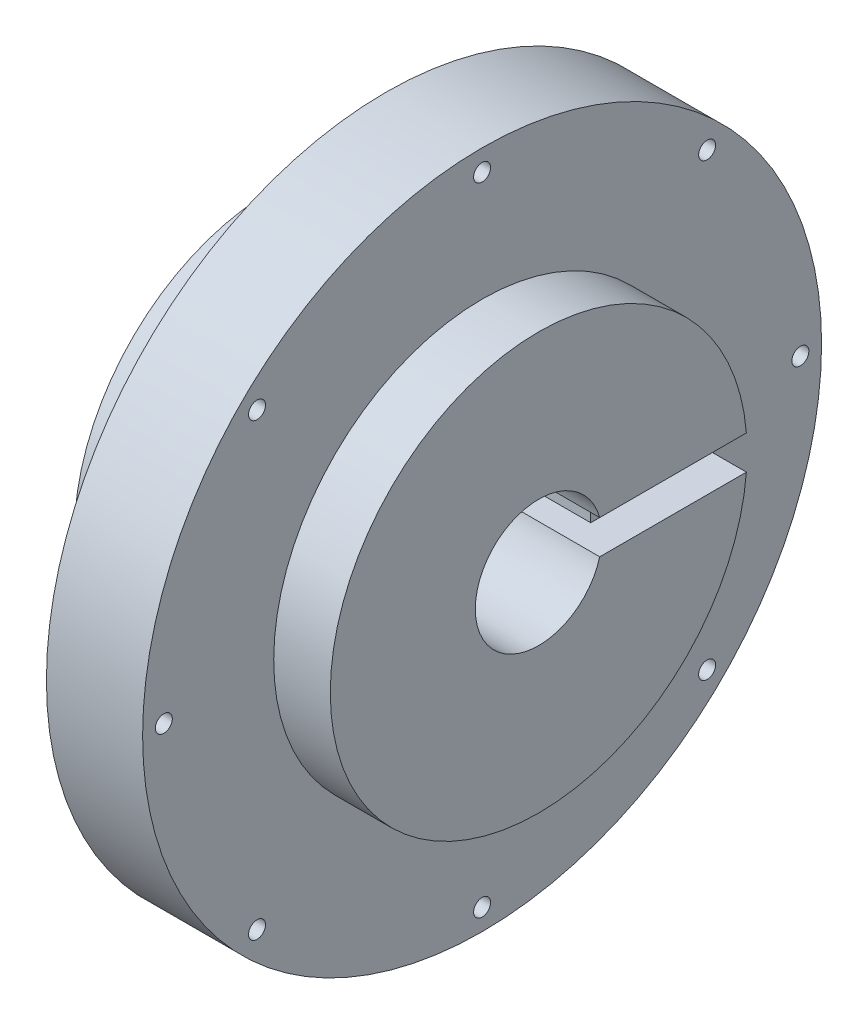
ISO-10303-21;
HEADER;
FILE_DESCRIPTION(('STEP AP214'),'2;1');
FILE_NAME('part.step','',(''),(''),'','','');
FILE_SCHEMA(('AUTOMOTIVE_DESIGN { 1 0 10303 214 1 1 1 1 }'));
ENDSEC;
DATA;
#1=APPLICATION_CONTEXT('core data for automotive mechanical design processes');
#2=APPLICATION_PROTOCOL_DEFINITION('international standard','automotive_design',2000,#1);
#3=PRODUCT_CONTEXT('',#1,'mechanical');
#4=PRODUCT('Part','Part','',(#3));
#5=PRODUCT_RELATED_PRODUCT_CATEGORY('part','',(#4));
#6=PRODUCT_DEFINITION_FORMATION('','',#4);
#7=PRODUCT_DEFINITION_CONTEXT('part definition',#1,'design');
#8=PRODUCT_DEFINITION('design','',#6,#7);
#9=PRODUCT_DEFINITION_SHAPE('','',#8);
#10=(LENGTH_UNIT() NAMED_UNIT(*) SI_UNIT(.MILLI.,.METRE.));
#11=(NAMED_UNIT(*) PLANE_ANGLE_UNIT() SI_UNIT($,.RADIAN.));
#12=(NAMED_UNIT(*) SI_UNIT($,.STERADIAN.) SOLID_ANGLE_UNIT());
#13=UNCERTAINTY_MEASURE_WITH_UNIT(LENGTH_MEASURE(1.E-05),#10,'distance_accuracy_value','');
#14=(GEOMETRIC_REPRESENTATION_CONTEXT(3) GLOBAL_UNCERTAINTY_ASSIGNED_CONTEXT((#13)) GLOBAL_UNIT_ASSIGNED_CONTEXT((#10,
#11,#12)) REPRESENTATION_CONTEXT('',''));
#15=CARTESIAN_POINT('',(0.,0.,0.));
#16=DIRECTION('',(0.,0.,1.));
#17=DIRECTION('',(1.,0.,0.));
#18=AXIS2_PLACEMENT_3D('',#15,#16,#17);
#19=CARTESIAN_POINT('',(51.,63.,-15.2));
#20=DIRECTION('',(0.,0.,1.));
#21=DIRECTION('',(1.,0.,0.));
#22=AXIS2_PLACEMENT_3D('',#19,#20,#21);
#23=PLANE('',#22);
#24=DIRECTION('',(-1.,0.,0.));
#25=VECTOR('',#24,1.);
#26=CARTESIAN_POINT('',(51.,57.,-15.2));
#27=LINE('',#26,#25);
#28=CARTESIAN_POINT('',(4.00000000000002,57.,-15.2));
#29=VERTEX_POINT('',#28);
#30=CARTESIAN_POINT('',(-23.,57.,-15.2));
#31=VERTEX_POINT('',#30);
#32=EDGE_CURVE('E114',#29,#31,#27,.T.);
#33=ORIENTED_EDGE('',*,*,#32,.F.);
#34=DIRECTION('',(0.,-1.,0.));
#35=VECTOR('',#34,1.);
#36=CARTESIAN_POINT('',(4.00000000000001,63.,-15.2));
#37=LINE('',#36,#35);
#38=CARTESIAN_POINT('',(4.00000000000001,63.,-15.2));
#39=VERTEX_POINT('',#38);
#40=EDGE_CURVE('E55',#39,#29,#37,.T.);
#41=ORIENTED_EDGE('',*,*,#40,.F.);
#42=DIRECTION('',(-1.,0.,0.));
#43=VECTOR('',#42,1.);
#44=CARTESIAN_POINT('',(51.,63.,-15.2));
#45=LINE('',#44,#43);
#46=CARTESIAN_POINT('',(-23.,63.,-15.2));
#47=VERTEX_POINT('',#46);
#48=EDGE_CURVE('E106',#39,#47,#45,.T.);
#49=ORIENTED_EDGE('',*,*,#48,.T.);
#50=DIRECTION('',(0.,1.,0.));
#51=VECTOR('',#50,1.);
#52=CARTESIAN_POINT('',(-23.,63.,-15.2));
#53=LINE('',#52,#51);
#54=EDGE_CURVE('E110',#31,#47,#53,.T.);
#55=ORIENTED_EDGE('',*,*,#54,.F.);
#56=EDGE_LOOP('',(#33,#41,#49,#55));
#57=FACE_BOUND('',#56,.T.);
#58=ADVANCED_FACE('F38',(#57),#23,.T.);
#59=CARTESIAN_POINT('',(10.,60.,0.));
#60=DIRECTION('',(1.,0.,0.));
#61=DIRECTION('',(0.,0.,-1.));
#62=AXIS2_PLACEMENT_3D('',#59,#60,#61);
#63=PLANE('',#62);
#64=DIRECTION('',(0.,0.,-1.));
#65=VECTOR('',#64,1.);
#66=CARTESIAN_POINT('',(10.,63.,0.));
#67=LINE('',#66,#65);
#68=CARTESIAN_POINT('',(10.,63.,-10.790736768173));
#69=VERTEX_POINT('',#68);
#70=CARTESIAN_POINT('',(10.,63.,-36.7076136516663));
#71=VERTEX_POINT('',#70);
#72=EDGE_CURVE('E63',#69,#71,#67,.T.);
#73=ORIENTED_EDGE('',*,*,#72,.T.);
#74=CARTESIAN_POINT('',(10.,60.,0.));
#75=DIRECTION('',(1.,0.,0.));
#76=DIRECTION('',(0.,0.,-1.));
#77=AXIS2_PLACEMENT_3D('',#74,#75,#76);
#78=CIRCLE('',#77,36.83);
#79=CARTESIAN_POINT('',(10.,57.,-36.7076136516663));
#80=VERTEX_POINT('',#79);
#81=EDGE_CURVE('E223',#71,#80,#78,.T.);
#82=ORIENTED_EDGE('',*,*,#81,.T.);
#83=DIRECTION('',(0.,0.,1.));
#84=VECTOR('',#83,1.);
#85=CARTESIAN_POINT('',(10.,57.,0.));
#86=LINE('',#85,#84);
#87=CARTESIAN_POINT('',(10.,57.,-10.790736768173));
#88=VERTEX_POINT('',#87);
#89=EDGE_CURVE('E156',#80,#88,#86,.T.);
#90=ORIENTED_EDGE('',*,*,#89,.T.);
#91=CARTESIAN_POINT('',(10.,60.,0.));
#92=DIRECTION('',(1.,0.,0.));
#93=DIRECTION('',(0.,0.,-1.));
#94=AXIS2_PLACEMENT_3D('',#91,#92,#93);
#95=CIRCLE('',#94,11.2);
#96=EDGE_CURVE('E162',#69,#88,#95,.T.);
#97=ORIENTED_EDGE('',*,*,#96,.F.);
#98=EDGE_LOOP('',(#73,#82,#90,#97));
#99=FACE_BOUND('',#98,.T.);
#100=ADVANCED_FACE('F300',(#99),#63,.T.);
#101=CARTESIAN_POINT('',(-19.,60.,0.));
#102=DIRECTION('',(1.,0.,0.));
#103=DIRECTION('',(0.,0.,-1.));
#104=AXIS2_PLACEMENT_3D('',#101,#102,#103);
#105=CYLINDRICAL_SURFACE('',#104,11.2);
#106=DIRECTION('',(1.,0.,0.));
#107=VECTOR('',#106,1.);
#108=CARTESIAN_POINT('',(-19.,63.,-10.790736768173));
#109=LINE('',#108,#107);
#110=CARTESIAN_POINT('',(-19.,63.,-10.790736768173));
#111=VERTEX_POINT('',#110);
#112=EDGE_CURVE('E159',#69,#111,#109,.F.);
#113=ORIENTED_EDGE('',*,*,#112,.F.);
#114=ORIENTED_EDGE('',*,*,#96,.T.);
#115=DIRECTION('',(1.,0.,0.));
#116=VECTOR('',#115,1.);
#117=CARTESIAN_POINT('',(-19.,57.,-10.790736768173));
#118=LINE('',#117,#116);
#119=CARTESIAN_POINT('',(-19.,57.,-10.790736768173));
#120=VERTEX_POINT('',#119);
#121=EDGE_CURVE('E113',#120,#88,#118,.T.);
#122=ORIENTED_EDGE('',*,*,#121,.F.);
#123=CARTESIAN_POINT('',(-19.,60.,0.));
#124=DIRECTION('',(1.,0.,0.));
#125=DIRECTION('',(0.,0.,-1.));
#126=AXIS2_PLACEMENT_3D('',#123,#124,#125);
#127=CIRCLE('',#126,11.2);
#128=EDGE_CURVE('E163',#111,#120,#127,.T.);
#129=ORIENTED_EDGE('',*,*,#128,.F.);
#130=EDGE_LOOP('',(#113,#114,#122,#129));
#131=FACE_BOUND('',#130,.T.);
#132=ADVANCED_FACE('F307',(#131),#105,.F.);
#133=CARTESIAN_POINT('',(0.,60.,0.));
#134=DIRECTION('',(1.,0.,0.));
#135=DIRECTION('',(0.,0.,-1.));
#136=AXIS2_PLACEMENT_3D('',#133,#134,#135);
#137=PLANE('',#136);
#138=CARTESIAN_POINT('',(0.,59.9999999999998,56.25));
#139=DIRECTION('',(1.,0.,0.));
#140=DIRECTION('',(0.,0.,-1.));
#141=AXIS2_PLACEMENT_3D('',#138,#139,#140);
#142=CIRCLE('',#141,1.5);
#143=CARTESIAN_POINT('',(0.,59.9999999999998,54.75));
#144=VERTEX_POINT('',#143);
#145=EDGE_CURVE('E216',#144,#144,#142,.T.);
#146=ORIENTED_EDGE('',*,*,#145,.F.);
#147=EDGE_LOOP('',(#146));
#148=FACE_BOUND('',#147,.T.);
#149=CARTESIAN_POINT('',(0.,20.2252435582565,39.7747564417431));
#150=DIRECTION('',(1.,0.,0.));
#151=DIRECTION('',(0.,0.,-1.));
#152=AXIS2_PLACEMENT_3D('',#149,#150,#151);
#153=CIRCLE('',#152,1.5);
#154=CARTESIAN_POINT('',(0.,20.2252435582565,38.2747564417431));
#155=VERTEX_POINT('',#154);
#156=EDGE_CURVE('E213',#155,#155,#153,.T.);
#157=ORIENTED_EDGE('',*,*,#156,.F.);
#158=EDGE_LOOP('',(#157));
#159=FACE_BOUND('',#158,.T.);
#160=CARTESIAN_POINT('',(0.,3.75,0.));
#161=DIRECTION('',(1.,0.,0.));
#162=DIRECTION('',(0.,0.,-1.));
#163=AXIS2_PLACEMENT_3D('',#160,#161,#162);
#164=CIRCLE('',#163,1.5);
#165=CARTESIAN_POINT('',(0.,3.75,-1.5));
#166=VERTEX_POINT('',#165);
#167=EDGE_CURVE('E209',#166,#166,#164,.T.);
#168=ORIENTED_EDGE('',*,*,#167,.F.);
#169=EDGE_LOOP('',(#168));
#170=FACE_BOUND('',#169,.T.);
#171=CARTESIAN_POINT('',(0.,20.2252435582571,-39.7747564417436));
#172=DIRECTION('',(1.,0.,0.));
#173=DIRECTION('',(0.,0.,-1.));
#174=AXIS2_PLACEMENT_3D('',#171,#172,#173);
#175=CIRCLE('',#174,1.5);
#176=CARTESIAN_POINT('',(0.,20.2252435582571,-41.2747564417436));
#177=VERTEX_POINT('',#176);
#178=EDGE_CURVE('E205',#177,#177,#175,.T.);
#179=ORIENTED_EDGE('',*,*,#178,.F.);
#180=EDGE_LOOP('',(#179));
#181=FACE_BOUND('',#180,.T.);
#182=CARTESIAN_POINT('',(0.,60.0000000000006,-56.25));
#183=DIRECTION('',(1.,0.,0.));
#184=DIRECTION('',(0.,0.,-1.));
#185=AXIS2_PLACEMENT_3D('',#182,#183,#184);
#186=CIRCLE('',#185,1.5);
#187=CARTESIAN_POINT('',(0.,60.0000000000006,-57.75));
#188=VERTEX_POINT('',#187);
#189=EDGE_CURVE('E201',#188,#188,#186,.T.);
#190=ORIENTED_EDGE('',*,*,#189,.F.);
#191=EDGE_LOOP('',(#190));
#192=FACE_BOUND('',#191,.T.);
#193=CARTESIAN_POINT('',(0.,99.7747564417438,-39.7747564417428));
#194=DIRECTION('',(1.,0.,0.));
#195=DIRECTION('',(0.,0.,-1.));
#196=AXIS2_PLACEMENT_3D('',#193,#194,#195);
#197=CIRCLE('',#196,1.5);
#198=CARTESIAN_POINT('',(0.,99.7747564417438,-41.2747564417428));
#199=VERTEX_POINT('',#198);
#200=EDGE_CURVE('E197',#199,#199,#197,.T.);
#201=ORIENTED_EDGE('',*,*,#200,.F.);
#202=EDGE_LOOP('',(#201));
#203=FACE_BOUND('',#202,.T.);
#204=CARTESIAN_POINT('',(0.,99.7747564417432,39.7747564417434));
#205=DIRECTION('',(1.,0.,0.));
#206=DIRECTION('',(0.,0.,-1.));
#207=AXIS2_PLACEMENT_3D('',#204,#205,#206);
#208=CIRCLE('',#207,1.5);
#209=CARTESIAN_POINT('',(0.,99.7747564417432,38.2747564417434));
#210=VERTEX_POINT('',#209);
#211=EDGE_CURVE('E193',#210,#210,#208,.T.);
#212=ORIENTED_EDGE('',*,*,#211,.F.);
#213=EDGE_LOOP('',(#212));
#214=FACE_BOUND('',#213,.T.);
#215=CARTESIAN_POINT('',(0.,116.25,0.));
#216=DIRECTION('',(1.,0.,0.));
#217=DIRECTION('',(0.,0.,-1.));
#218=AXIS2_PLACEMENT_3D('',#215,#216,#217);
#219=CIRCLE('',#218,1.5);
#220=CARTESIAN_POINT('',(0.,116.25,-1.5));
#221=VERTEX_POINT('',#220);
#222=EDGE_CURVE('E220',#221,#221,#219,.T.);
#223=ORIENTED_EDGE('',*,*,#222,.F.);
#224=EDGE_LOOP('',(#223));
#225=FACE_BOUND('',#224,.T.);
#226=CARTESIAN_POINT('',(0.,60.,0.));
#227=DIRECTION('',(1.,0.,0.));
#228=DIRECTION('',(0.,0.,-1.));
#229=AXIS2_PLACEMENT_3D('',#226,#227,#228);
#230=CIRCLE('',#229,36.83);
#231=CARTESIAN_POINT('',(0.,60.,-36.83));
#232=VERTEX_POINT('',#231);
#233=EDGE_CURVE('E47',#232,#232,#230,.T.);
#234=ORIENTED_EDGE('',*,*,#233,.F.);
#235=EDGE_LOOP('',(#234));
#236=FACE_BOUND('',#235,.T.);
#237=CARTESIAN_POINT('',(0.,60.,0.));
#238=DIRECTION('',(-1.,0.,0.));
#239=DIRECTION('',(0.,0.,1.));
#240=AXIS2_PLACEMENT_3D('',#237,#238,#239);
#241=CIRCLE('',#240,60.);
#242=CARTESIAN_POINT('',(0.,60.,60.));
#243=VERTEX_POINT('',#242);
#244=EDGE_CURVE('E229',#243,#243,#241,.T.);
#245=ORIENTED_EDGE('',*,*,#244,.F.);
#246=EDGE_LOOP('',(#245));
#247=FACE_BOUND('',#246,.T.);
#248=ADVANCED_FACE('F40',(#148,#159,#170,#181,#192,#203,#214,#225,#236,#247),#137,.T.);
#249=CARTESIAN_POINT('',(-37.05,60.,0.));
#250=DIRECTION('',(-1.,0.,0.));
#251=DIRECTION('',(0.,0.,1.));
#252=AXIS2_PLACEMENT_3D('',#249,#250,#251);
#253=CYLINDRICAL_SURFACE('',#252,60.);
#254=ORIENTED_EDGE('',*,*,#244,.T.);
#255=EDGE_LOOP('',(#254));
#256=FACE_BOUND('',#255,.T.);
#257=CARTESIAN_POINT('',(-17.,60.,0.));
#258=DIRECTION('',(-1.,0.,0.));
#259=DIRECTION('',(0.,0.,1.));
#260=AXIS2_PLACEMENT_3D('',#257,#258,#259);
#261=CIRCLE('',#260,60.);
#262=CARTESIAN_POINT('',(-17.,60.,60.));
#263=VERTEX_POINT('',#262);
#264=EDGE_CURVE('E235',#263,#263,#261,.T.);
#265=ORIENTED_EDGE('',*,*,#264,.F.);
#266=EDGE_LOOP('',(#265));
#267=FACE_BOUND('',#266,.T.);
#268=ADVANCED_FACE('F260',(#256,#267),#253,.T.);
#269=CARTESIAN_POINT('',(-17.,0.,0.));
#270=DIRECTION('',(-1.,0.,0.));
#271=DIRECTION('',(0.,0.,1.));
#272=AXIS2_PLACEMENT_3D('',#269,#270,#271);
#273=PLANE('',#272);
#274=CARTESIAN_POINT('',(-17.,59.9999999999998,56.25));
#275=DIRECTION('',(-1.,0.,0.));
#276=DIRECTION('',(0.,0.,1.));
#277=AXIS2_PLACEMENT_3D('',#274,#275,#276);
#278=CIRCLE('',#277,1.5);
#279=CARTESIAN_POINT('',(-17.,59.9999999999998,57.75));
#280=VERTEX_POINT('',#279);
#281=EDGE_CURVE('E42',#280,#280,#278,.T.);
#282=ORIENTED_EDGE('',*,*,#281,.F.);
#283=EDGE_LOOP('',(#282));
#284=FACE_BOUND('',#283,.T.);
#285=CARTESIAN_POINT('',(-17.,20.2252435582565,39.7747564417431));
#286=DIRECTION('',(-1.,0.,0.));
#287=DIRECTION('',(0.,0.,1.));
#288=AXIS2_PLACEMENT_3D('',#285,#286,#287);
#289=CIRCLE('',#288,1.5);
#290=CARTESIAN_POINT('',(-17.,20.2252435582565,41.2747564417431));
#291=VERTEX_POINT('',#290);
#292=EDGE_CURVE('E212',#291,#291,#289,.T.);
#293=ORIENTED_EDGE('',*,*,#292,.F.);
#294=EDGE_LOOP('',(#293));
#295=FACE_BOUND('',#294,.T.);
#296=CARTESIAN_POINT('',(-17.,3.75,0.));
#297=DIRECTION('',(-1.,0.,0.));
#298=DIRECTION('',(0.,0.,1.));
#299=AXIS2_PLACEMENT_3D('',#296,#297,#298);
#300=CIRCLE('',#299,1.5);
#301=CARTESIAN_POINT('',(-17.,3.75,1.5));
#302=VERTEX_POINT('',#301);
#303=EDGE_CURVE('E208',#302,#302,#300,.T.);
#304=ORIENTED_EDGE('',*,*,#303,.F.);
#305=EDGE_LOOP('',(#304));
#306=FACE_BOUND('',#305,.T.);
#307=CARTESIAN_POINT('',(-17.,20.2252435582571,-39.7747564417436));
#308=DIRECTION('',(-1.,0.,0.));
#309=DIRECTION('',(0.,0.,1.));
#310=AXIS2_PLACEMENT_3D('',#307,#308,#309);
#311=CIRCLE('',#310,1.5);
#312=CARTESIAN_POINT('',(-17.,20.2252435582571,-38.2747564417436));
#313=VERTEX_POINT('',#312);
#314=EDGE_CURVE('E204',#313,#313,#311,.T.);
#315=ORIENTED_EDGE('',*,*,#314,.F.);
#316=EDGE_LOOP('',(#315));
#317=FACE_BOUND('',#316,.T.);
#318=CARTESIAN_POINT('',(-17.,60.0000000000006,-56.25));
#319=DIRECTION('',(-1.,0.,0.));
#320=DIRECTION('',(0.,0.,1.));
#321=AXIS2_PLACEMENT_3D('',#318,#319,#320);
#322=CIRCLE('',#321,1.5);
#323=CARTESIAN_POINT('',(-17.,60.0000000000006,-54.75));
#324=VERTEX_POINT('',#323);
#325=EDGE_CURVE('E200',#324,#324,#322,.T.);
#326=ORIENTED_EDGE('',*,*,#325,.F.);
#327=EDGE_LOOP('',(#326));
#328=FACE_BOUND('',#327,.T.);
#329=CARTESIAN_POINT('',(-17.,99.7747564417438,-39.7747564417428));
#330=DIRECTION('',(-1.,0.,0.));
#331=DIRECTION('',(0.,0.,1.));
#332=AXIS2_PLACEMENT_3D('',#329,#330,#331);
#333=CIRCLE('',#332,1.5);
#334=CARTESIAN_POINT('',(-17.,99.7747564417438,-38.2747564417428));
#335=VERTEX_POINT('',#334);
#336=EDGE_CURVE('E196',#335,#335,#333,.T.);
#337=ORIENTED_EDGE('',*,*,#336,.F.);
#338=EDGE_LOOP('',(#337));
#339=FACE_BOUND('',#338,.T.);
#340=CARTESIAN_POINT('',(-17.,99.7747564417432,39.7747564417434));
#341=DIRECTION('',(-1.,0.,0.));
#342=DIRECTION('',(0.,0.,1.));
#343=AXIS2_PLACEMENT_3D('',#340,#341,#342);
#344=CIRCLE('',#343,1.5);
#345=CARTESIAN_POINT('',(-17.,99.7747564417432,41.2747564417434));
#346=VERTEX_POINT('',#345);
#347=EDGE_CURVE('E190',#346,#346,#344,.T.);
#348=ORIENTED_EDGE('',*,*,#347,.F.);
#349=EDGE_LOOP('',(#348));
#350=FACE_BOUND('',#349,.T.);
#351=CARTESIAN_POINT('',(-17.,116.25,0.));
#352=DIRECTION('',(-1.,0.,0.));
#353=DIRECTION('',(0.,0.,1.));
#354=AXIS2_PLACEMENT_3D('',#351,#352,#353);
#355=CIRCLE('',#354,1.5);
#356=CARTESIAN_POINT('',(-17.,116.25,1.5));
#357=VERTEX_POINT('',#356);
#358=EDGE_CURVE('E219',#357,#357,#355,.T.);
#359=ORIENTED_EDGE('',*,*,#358,.F.);
#360=EDGE_LOOP('',(#359));
#361=FACE_BOUND('',#360,.T.);
#362=ORIENTED_EDGE('',*,*,#264,.T.);
#363=EDGE_LOOP('',(#362));
#364=FACE_BOUND('',#363,.T.);
#365=CARTESIAN_POINT('',(-17.,60.,0.));
#366=DIRECTION('',(-1.,0.,0.));
#367=DIRECTION('',(0.,0.,1.));
#368=AXIS2_PLACEMENT_3D('',#365,#366,#367);
#369=CIRCLE('',#368,35.);
#370=CARTESIAN_POINT('',(-17.,60.,35.));
#371=VERTEX_POINT('',#370);
#372=EDGE_CURVE('E232',#371,#371,#369,.T.);
#373=ORIENTED_EDGE('',*,*,#372,.F.);
#374=EDGE_LOOP('',(#373));
#375=FACE_BOUND('',#374,.T.);
#376=ADVANCED_FACE('F256',(#284,#295,#306,#317,#328,#339,#350,#361,#364,#375),#273,.T.);
#377=CARTESIAN_POINT('',(-37.05,60.,0.));
#378=DIRECTION('',(-1.,0.,0.));
#379=DIRECTION('',(0.,0.,1.));
#380=AXIS2_PLACEMENT_3D('',#377,#378,#379);
#381=CYLINDRICAL_SURFACE('',#380,35.);
#382=ORIENTED_EDGE('',*,*,#372,.T.);
#383=EDGE_LOOP('',(#382));
#384=FACE_BOUND('',#383,.T.);
#385=CARTESIAN_POINT('',(-37.05,60.,0.));
#386=DIRECTION('',(-1.,0.,0.));
#387=DIRECTION('',(0.,0.,1.));
#388=AXIS2_PLACEMENT_3D('',#385,#386,#387);
#389=CIRCLE('',#388,35.);
#390=CARTESIAN_POINT('',(-37.05,60.,35.));
#391=VERTEX_POINT('',#390);
#392=EDGE_CURVE('E226',#391,#391,#389,.T.);
#393=ORIENTED_EDGE('',*,*,#392,.F.);
#394=EDGE_LOOP('',(#393));
#395=FACE_BOUND('',#394,.T.);
#396=ADVANCED_FACE('F259',(#384,#395),#381,.T.);
#397=CARTESIAN_POINT('',(-37.05,25.,0.));
#398=DIRECTION('',(-1.,0.,0.));
#399=DIRECTION('',(0.,0.,1.));
#400=AXIS2_PLACEMENT_3D('',#397,#398,#399);
#401=PLANE('',#400);
#402=CARTESIAN_POINT('',(-37.05,41.44,-18.56));
#403=DIRECTION('',(-1.,0.,0.));
#404=DIRECTION('',(0.,0.,1.));
#405=AXIS2_PLACEMENT_3D('',#402,#403,#404);
#406=CIRCLE('',#405,2.);
#407=CARTESIAN_POINT('',(-37.05,41.44,-16.56));
#408=VERTEX_POINT('',#407);
#409=EDGE_CURVE('E182',#408,#408,#406,.T.);
#410=ORIENTED_EDGE('',*,*,#409,.F.);
#411=EDGE_LOOP('',(#410));
#412=FACE_BOUND('',#411,.T.);
#413=CARTESIAN_POINT('',(-37.05,41.44,18.56));
#414=DIRECTION('',(-1.,0.,0.));
#415=DIRECTION('',(0.,0.,1.));
#416=AXIS2_PLACEMENT_3D('',#413,#414,#415);
#417=CIRCLE('',#416,2.);
#418=CARTESIAN_POINT('',(-37.05,41.44,20.56));
#419=VERTEX_POINT('',#418);
#420=EDGE_CURVE('E176',#419,#419,#417,.T.);
#421=ORIENTED_EDGE('',*,*,#420,.F.);
#422=EDGE_LOOP('',(#421));
#423=FACE_BOUND('',#422,.T.);
#424=CARTESIAN_POINT('',(-37.05,78.56,18.56));
#425=DIRECTION('',(-1.,0.,0.));
#426=DIRECTION('',(0.,0.,1.));
#427=AXIS2_PLACEMENT_3D('',#424,#425,#426);
#428=CIRCLE('',#427,2.);
#429=CARTESIAN_POINT('',(-37.05,78.56,20.56));
#430=VERTEX_POINT('',#429);
#431=EDGE_CURVE('E169',#430,#430,#428,.T.);
#432=ORIENTED_EDGE('',*,*,#431,.F.);
#433=EDGE_LOOP('',(#432));
#434=FACE_BOUND('',#433,.T.);
#435=CARTESIAN_POINT('',(-37.05,78.56,-18.56));
#436=DIRECTION('',(-1.,0.,0.));
#437=DIRECTION('',(0.,0.,1.));
#438=AXIS2_PLACEMENT_3D('',#435,#436,#437);
#439=CIRCLE('',#438,2.);
#440=CARTESIAN_POINT('',(-37.05,78.56,-16.56));
#441=VERTEX_POINT('',#440);
#442=EDGE_CURVE('E172',#441,#441,#439,.T.);
#443=ORIENTED_EDGE('',*,*,#442,.F.);
#444=EDGE_LOOP('',(#443));
#445=FACE_BOUND('',#444,.T.);
#446=ORIENTED_EDGE('',*,*,#392,.T.);
#447=EDGE_LOOP('',(#446));
#448=FACE_BOUND('',#447,.T.);
#449=ADVANCED_FACE('F281',(#412,#423,#434,#445,#448),#401,.T.);
#450=CARTESIAN_POINT('',(10.,60.,0.));
#451=DIRECTION('',(-1.,0.,0.));
#452=DIRECTION('',(0.,0.,1.));
#453=AXIS2_PLACEMENT_3D('',#450,#451,#452);
#454=CYLINDRICAL_SURFACE('',#453,36.83);
#455=ORIENTED_EDGE('',*,*,#81,.F.);
#456=DIRECTION('',(-1.,0.,0.));
#457=VECTOR('',#456,1.);
#458=CARTESIAN_POINT('',(10.,63.,-36.7076136516663));
#459=LINE('',#458,#457);
#460=CARTESIAN_POINT('',(4.00000000000001,63.,-36.7076136516663));
#461=VERTEX_POINT('',#460);
#462=EDGE_CURVE('E151',#71,#461,#459,.T.);
#463=ORIENTED_EDGE('',*,*,#462,.T.);
#464=CARTESIAN_POINT('',(4.00000000000001,60.,0.));
#465=DIRECTION('',(1.,0.,0.));
#466=DIRECTION('',(0.,0.,-1.));
#467=AXIS2_PLACEMENT_3D('',#464,#465,#466);
#468=CIRCLE('',#467,36.83);
#469=CARTESIAN_POINT('',(4.00000000000001,57.,-36.7076136516663));
#470=VERTEX_POINT('',#469);
#471=EDGE_CURVE('E146',#470,#461,#468,.T.);
#472=ORIENTED_EDGE('',*,*,#471,.F.);
#473=DIRECTION('',(-1.,0.,0.));
#474=VECTOR('',#473,1.);
#475=CARTESIAN_POINT('',(10.,57.,-36.7076136516663));
#476=LINE('',#475,#474);
#477=EDGE_CURVE('E148',#470,#80,#476,.F.);
#478=ORIENTED_EDGE('',*,*,#477,.T.);
#479=EDGE_LOOP('',(#455,#463,#472,#478));
#480=FACE_BOUND('',#479,.T.);
#481=ORIENTED_EDGE('',*,*,#233,.T.);
#482=EDGE_LOOP('',(#481));
#483=FACE_BOUND('',#482,.T.);
#484=ADVANCED_FACE('F286',(#480,#483),#454,.T.);
#485=CARTESIAN_POINT('',(-37.05,116.25,0.));
#486=DIRECTION('',(1.,0.,0.));
#487=DIRECTION('',(0.,0.,-1.));
#488=AXIS2_PLACEMENT_3D('',#485,#486,#487);
#489=CYLINDRICAL_SURFACE('',#488,1.5);
#490=ORIENTED_EDGE('',*,*,#222,.T.);
#491=EDGE_LOOP('',(#490));
#492=FACE_BOUND('',#491,.T.);
#493=ORIENTED_EDGE('',*,*,#358,.T.);
#494=EDGE_LOOP('',(#493));
#495=FACE_BOUND('',#494,.T.);
#496=ADVANCED_FACE('F294',(#492,#495),#489,.F.);
#497=CARTESIAN_POINT('',(-37.05,99.7747564417432,39.7747564417434));
#498=DIRECTION('',(1.,0.,0.));
#499=DIRECTION('',(0.,0.,-1.));
#500=AXIS2_PLACEMENT_3D('',#497,#498,#499);
#501=CYLINDRICAL_SURFACE('',#500,1.5);
#502=ORIENTED_EDGE('',*,*,#211,.T.);
#503=EDGE_LOOP('',(#502));
#504=FACE_BOUND('',#503,.T.);
#505=ORIENTED_EDGE('',*,*,#347,.T.);
#506=EDGE_LOOP('',(#505));
#507=FACE_BOUND('',#506,.T.);
#508=ADVANCED_FACE('F359',(#504,#507),#501,.F.);
#509=CARTESIAN_POINT('',(-37.05,99.7747564417438,-39.7747564417428));
#510=DIRECTION('',(1.,0.,0.));
#511=DIRECTION('',(0.,0.,-1.));
#512=AXIS2_PLACEMENT_3D('',#509,#510,#511);
#513=CYLINDRICAL_SURFACE('',#512,1.5);
#514=ORIENTED_EDGE('',*,*,#200,.T.);
#515=EDGE_LOOP('',(#514));
#516=FACE_BOUND('',#515,.T.);
#517=ORIENTED_EDGE('',*,*,#336,.T.);
#518=EDGE_LOOP('',(#517));
#519=FACE_BOUND('',#518,.T.);
#520=ADVANCED_FACE('F355',(#516,#519),#513,.F.);
#521=CARTESIAN_POINT('',(-37.05,60.0000000000006,-56.25));
#522=DIRECTION('',(1.,0.,0.));
#523=DIRECTION('',(0.,0.,-1.));
#524=AXIS2_PLACEMENT_3D('',#521,#522,#523);
#525=CYLINDRICAL_SURFACE('',#524,1.5);
#526=ORIENTED_EDGE('',*,*,#189,.T.);
#527=EDGE_LOOP('',(#526));
#528=FACE_BOUND('',#527,.T.);
#529=ORIENTED_EDGE('',*,*,#325,.T.);
#530=EDGE_LOOP('',(#529));
#531=FACE_BOUND('',#530,.T.);
#532=ADVANCED_FACE('F351',(#528,#531),#525,.F.);
#533=CARTESIAN_POINT('',(-37.05,20.2252435582571,-39.7747564417436));
#534=DIRECTION('',(1.,0.,0.));
#535=DIRECTION('',(0.,0.,-1.));
#536=AXIS2_PLACEMENT_3D('',#533,#534,#535);
#537=CYLINDRICAL_SURFACE('',#536,1.5);
#538=ORIENTED_EDGE('',*,*,#178,.T.);
#539=EDGE_LOOP('',(#538));
#540=FACE_BOUND('',#539,.T.);
#541=ORIENTED_EDGE('',*,*,#314,.T.);
#542=EDGE_LOOP('',(#541));
#543=FACE_BOUND('',#542,.T.);
#544=ADVANCED_FACE('F354',(#540,#543),#537,.F.);
#545=CARTESIAN_POINT('',(-37.05,3.75,0.));
#546=DIRECTION('',(1.,0.,0.));
#547=DIRECTION('',(0.,0.,-1.));
#548=AXIS2_PLACEMENT_3D('',#545,#546,#547);
#549=CYLINDRICAL_SURFACE('',#548,1.5);
#550=ORIENTED_EDGE('',*,*,#167,.T.);
#551=EDGE_LOOP('',(#550));
#552=FACE_BOUND('',#551,.T.);
#553=ORIENTED_EDGE('',*,*,#303,.T.);
#554=EDGE_LOOP('',(#553));
#555=FACE_BOUND('',#554,.T.);
#556=ADVANCED_FACE('F365',(#552,#555),#549,.F.);
#557=CARTESIAN_POINT('',(-37.05,20.2252435582565,39.7747564417431));
#558=DIRECTION('',(1.,0.,0.));
#559=DIRECTION('',(0.,0.,-1.));
#560=AXIS2_PLACEMENT_3D('',#557,#558,#559);
#561=CYLINDRICAL_SURFACE('',#560,1.5);
#562=ORIENTED_EDGE('',*,*,#156,.T.);
#563=EDGE_LOOP('',(#562));
#564=FACE_BOUND('',#563,.T.);
#565=ORIENTED_EDGE('',*,*,#292,.T.);
#566=EDGE_LOOP('',(#565));
#567=FACE_BOUND('',#566,.T.);
#568=ADVANCED_FACE('F254',(#564,#567),#561,.F.);
#569=CARTESIAN_POINT('',(-37.05,59.9999999999998,56.25));
#570=DIRECTION('',(1.,0.,0.));
#571=DIRECTION('',(0.,0.,-1.));
#572=AXIS2_PLACEMENT_3D('',#569,#570,#571);
#573=CYLINDRICAL_SURFACE('',#572,1.5);
#574=ORIENTED_EDGE('',*,*,#145,.T.);
#575=EDGE_LOOP('',(#574));
#576=FACE_BOUND('',#575,.T.);
#577=ORIENTED_EDGE('',*,*,#281,.T.);
#578=EDGE_LOOP('',(#577));
#579=FACE_BOUND('',#578,.T.);
#580=ADVANCED_FACE('F349',(#576,#579),#573,.F.);
#581=CARTESIAN_POINT('',(-27.05,78.56,-18.56));
#582=DIRECTION('',(-1.,0.,0.));
#583=DIRECTION('',(0.,0.,1.));
#584=AXIS2_PLACEMENT_3D('',#581,#582,#583);
#585=CYLINDRICAL_SURFACE('',#584,2.);
#586=CARTESIAN_POINT('',(-27.05,78.56,-18.56));
#587=DIRECTION('',(-1.,0.,0.));
#588=DIRECTION('',(0.,0.,1.));
#589=AXIS2_PLACEMENT_3D('',#586,#587,#588);
#590=CIRCLE('',#589,2.);
#591=CARTESIAN_POINT('',(-27.05,78.56,-16.56));
#592=VERTEX_POINT('',#591);
#593=EDGE_CURVE('E187',#592,#592,#590,.T.);
#594=ORIENTED_EDGE('',*,*,#593,.F.);
#595=EDGE_LOOP('',(#594));
#596=FACE_BOUND('',#595,.T.);
#597=ORIENTED_EDGE('',*,*,#442,.T.);
#598=EDGE_LOOP('',(#597));
#599=FACE_BOUND('',#598,.T.);
#600=ADVANCED_FACE('F346',(#596,#599),#585,.F.);
#601=CARTESIAN_POINT('',(-27.05,78.56,-18.56));
#602=DIRECTION('',(-1.,0.,0.));
#603=DIRECTION('',(0.,0.,1.));
#604=AXIS2_PLACEMENT_3D('',#601,#602,#603);
#605=PLANE('',#604);
#606=ORIENTED_EDGE('',*,*,#593,.T.);
#607=EDGE_LOOP('',(#606));
#608=FACE_BOUND('',#607,.T.);
#609=ADVANCED_FACE('F324',(#608),#605,.T.);
#610=CARTESIAN_POINT('',(-27.05,78.56,18.56));
#611=DIRECTION('',(-1.,0.,0.));
#612=DIRECTION('',(0.,0.,1.));
#613=AXIS2_PLACEMENT_3D('',#610,#611,#612);
#614=CYLINDRICAL_SURFACE('',#613,2.);
#615=CARTESIAN_POINT('',(-27.05,78.56,18.56));
#616=DIRECTION('',(-1.,0.,0.));
#617=DIRECTION('',(0.,0.,1.));
#618=AXIS2_PLACEMENT_3D('',#615,#616,#617);
#619=CIRCLE('',#618,2.);
#620=CARTESIAN_POINT('',(-27.05,78.56,20.56));
#621=VERTEX_POINT('',#620);
#622=EDGE_CURVE('E173',#621,#621,#619,.T.);
#623=ORIENTED_EDGE('',*,*,#622,.F.);
#624=EDGE_LOOP('',(#623));
#625=FACE_BOUND('',#624,.T.);
#626=ORIENTED_EDGE('',*,*,#431,.T.);
#627=EDGE_LOOP('',(#626));
#628=FACE_BOUND('',#627,.T.);
#629=ADVANCED_FACE('F320',(#625,#628),#614,.F.);
#630=CARTESIAN_POINT('',(-27.05,78.56,18.56));
#631=DIRECTION('',(-1.,0.,0.));
#632=DIRECTION('',(0.,0.,1.));
#633=AXIS2_PLACEMENT_3D('',#630,#631,#632);
#634=PLANE('',#633);
#635=ORIENTED_EDGE('',*,*,#622,.T.);
#636=EDGE_LOOP('',(#635));
#637=FACE_BOUND('',#636,.T.);
#638=ADVANCED_FACE('F323',(#637),#634,.T.);
#639=CARTESIAN_POINT('',(-27.05,41.44,18.56));
#640=DIRECTION('',(-1.,0.,0.));
#641=DIRECTION('',(0.,0.,1.));
#642=AXIS2_PLACEMENT_3D('',#639,#640,#641);
#643=CYLINDRICAL_SURFACE('',#642,2.);
#644=CARTESIAN_POINT('',(-27.05,41.44,18.56));
#645=DIRECTION('',(-1.,0.,0.));
#646=DIRECTION('',(0.,0.,1.));
#647=AXIS2_PLACEMENT_3D('',#644,#645,#646);
#648=CIRCLE('',#647,2.);
#649=CARTESIAN_POINT('',(-27.05,41.44,20.56));
#650=VERTEX_POINT('',#649);
#651=EDGE_CURVE('E179',#650,#650,#648,.T.);
#652=ORIENTED_EDGE('',*,*,#651,.F.);
#653=EDGE_LOOP('',(#652));
#654=FACE_BOUND('',#653,.T.);
#655=ORIENTED_EDGE('',*,*,#420,.T.);
#656=EDGE_LOOP('',(#655));
#657=FACE_BOUND('',#656,.T.);
#658=ADVANCED_FACE('F328',(#654,#657),#643,.F.);
#659=CARTESIAN_POINT('',(-27.05,41.44,18.56));
#660=DIRECTION('',(-1.,0.,0.));
#661=DIRECTION('',(0.,0.,1.));
#662=AXIS2_PLACEMENT_3D('',#659,#660,#661);
#663=PLANE('',#662);
#664=ORIENTED_EDGE('',*,*,#651,.T.);
#665=EDGE_LOOP('',(#664));
#666=FACE_BOUND('',#665,.T.);
#667=ADVANCED_FACE('F332',(#666),#663,.T.);
#668=CARTESIAN_POINT('',(-27.05,41.44,-18.56));
#669=DIRECTION('',(-1.,0.,0.));
#670=DIRECTION('',(0.,0.,1.));
#671=AXIS2_PLACEMENT_3D('',#668,#669,#670);
#672=CYLINDRICAL_SURFACE('',#671,2.);
#673=CARTESIAN_POINT('',(-27.05,41.44,-18.56));
#674=DIRECTION('',(-1.,0.,0.));
#675=DIRECTION('',(0.,0.,1.));
#676=AXIS2_PLACEMENT_3D('',#673,#674,#675);
#677=CIRCLE('',#676,2.);
#678=CARTESIAN_POINT('',(-27.05,41.44,-16.56));
#679=VERTEX_POINT('',#678);
#680=EDGE_CURVE('E166',#679,#679,#677,.T.);
#681=ORIENTED_EDGE('',*,*,#680,.F.);
#682=EDGE_LOOP('',(#681));
#683=FACE_BOUND('',#682,.T.);
#684=ORIENTED_EDGE('',*,*,#409,.T.);
#685=EDGE_LOOP('',(#684));
#686=FACE_BOUND('',#685,.T.);
#687=ADVANCED_FACE('F336',(#683,#686),#672,.F.);
#688=CARTESIAN_POINT('',(-27.05,41.44,-18.56));
#689=DIRECTION('',(-1.,0.,0.));
#690=DIRECTION('',(0.,0.,1.));
#691=AXIS2_PLACEMENT_3D('',#688,#689,#690);
#692=PLANE('',#691);
#693=ORIENTED_EDGE('',*,*,#680,.T.);
#694=EDGE_LOOP('',(#693));
#695=FACE_BOUND('',#694,.T.);
#696=ADVANCED_FACE('F316',(#695),#692,.T.);
#697=CARTESIAN_POINT('',(-19.,60.,0.));
#698=DIRECTION('',(1.,0.,0.));
#699=DIRECTION('',(0.,0.,-1.));
#700=AXIS2_PLACEMENT_3D('',#697,#698,#699);
#701=PLANE('',#700);
#702=DIRECTION('',(0.,0.,1.));
#703=VECTOR('',#702,1.);
#704=CARTESIAN_POINT('',(-19.,63.,-15.2));
#705=LINE('',#704,#703);
#706=CARTESIAN_POINT('',(-19.,63.,1.98964118861895));
#707=VERTEX_POINT('',#706);
#708=EDGE_CURVE('E11',#111,#707,#705,.T.);
#709=ORIENTED_EDGE('',*,*,#708,.F.);
#710=ORIENTED_EDGE('',*,*,#128,.T.);
#711=DIRECTION('',(0.,0.,-1.));
#712=VECTOR('',#711,1.);
#713=CARTESIAN_POINT('',(-19.,57.,-15.2));
#714=LINE('',#713,#712);
#715=CARTESIAN_POINT('',(-19.,57.,1.98964118861895));
#716=VERTEX_POINT('',#715);
#717=EDGE_CURVE('E129',#716,#120,#714,.T.);
#718=ORIENTED_EDGE('',*,*,#717,.F.);
#719=DIRECTION('',(0.,-1.,0.));
#720=VECTOR('',#719,1.);
#721=CARTESIAN_POINT('',(-19.,63.,1.98964118861895));
#722=LINE('',#721,#720);
#723=EDGE_CURVE('E131',#707,#716,#722,.T.);
#724=ORIENTED_EDGE('',*,*,#723,.F.);
#725=EDGE_LOOP('',(#709,#710,#718,#724));
#726=FACE_BOUND('',#725,.T.);
#727=ADVANCED_FACE('F313',(#726),#701,.T.);
#728=CARTESIAN_POINT('',(51.,63.,-7.2));
#729=DIRECTION('',(0.,-1.,0.));
#730=DIRECTION('',(0.,0.,-1.));
#731=AXIS2_PLACEMENT_3D('',#728,#729,#730);
#732=PLANE('',#731);
#733=ORIENTED_EDGE('',*,*,#112,.T.);
#734=ORIENTED_EDGE('',*,*,#708,.T.);
#735=DIRECTION('',(1.,0.,0.));
#736=VECTOR('',#735,1.);
#737=CARTESIAN_POINT('',(-23.,63.,1.98964118861895));
#738=LINE('',#737,#736);
#739=CARTESIAN_POINT('',(-23.,63.,1.98964118861895));
#740=VERTEX_POINT('',#739);
#741=EDGE_CURVE('E120',#740,#707,#738,.T.);
#742=ORIENTED_EDGE('',*,*,#741,.F.);
#743=DIRECTION('',(0.,0.,1.));
#744=VECTOR('',#743,1.);
#745=CARTESIAN_POINT('',(-23.,63.,-15.2));
#746=LINE('',#745,#744);
#747=EDGE_CURVE('E117',#47,#740,#746,.T.);
#748=ORIENTED_EDGE('',*,*,#747,.F.);
#749=ORIENTED_EDGE('',*,*,#48,.F.);
#750=DIRECTION('',(0.,0.,1.));
#751=VECTOR('',#750,1.);
#752=CARTESIAN_POINT('',(4.00000000000001,63.,-15.2));
#753=LINE('',#752,#751);
#754=EDGE_CURVE('E144',#461,#39,#753,.T.);
#755=ORIENTED_EDGE('',*,*,#754,.F.);
#756=ORIENTED_EDGE('',*,*,#462,.F.);
#757=ORIENTED_EDGE('',*,*,#72,.F.);
#758=EDGE_LOOP('',(#733,#734,#742,#748,#749,#755,#756,#757));
#759=FACE_BOUND('',#758,.T.);
#760=ADVANCED_FACE('F118',(#759),#732,.T.);
#761=CARTESIAN_POINT('',(51.,57.,-7.2));
#762=DIRECTION('',(0.,1.,0.));
#763=DIRECTION('',(0.,0.,1.));
#764=AXIS2_PLACEMENT_3D('',#761,#762,#763);
#765=PLANE('',#764);
#766=ORIENTED_EDGE('',*,*,#89,.F.);
#767=ORIENTED_EDGE('',*,*,#477,.F.);
#768=DIRECTION('',(0.,0.,-1.));
#769=VECTOR('',#768,1.);
#770=CARTESIAN_POINT('',(4.00000000000001,57.,-15.2));
#771=LINE('',#770,#769);
#772=EDGE_CURVE('E142',#29,#470,#771,.T.);
#773=ORIENTED_EDGE('',*,*,#772,.F.);
#774=ORIENTED_EDGE('',*,*,#32,.T.);
#775=DIRECTION('',(0.,0.,-1.));
#776=VECTOR('',#775,1.);
#777=CARTESIAN_POINT('',(-23.,57.,-15.2));
#778=LINE('',#777,#776);
#779=CARTESIAN_POINT('',(-23.,57.,1.98964118861895));
#780=VERTEX_POINT('',#779);
#781=EDGE_CURVE('E128',#780,#31,#778,.T.);
#782=ORIENTED_EDGE('',*,*,#781,.F.);
#783=DIRECTION('',(1.,0.,0.));
#784=VECTOR('',#783,1.);
#785=CARTESIAN_POINT('',(-23.,57.,1.98964118861895));
#786=LINE('',#785,#784);
#787=EDGE_CURVE('E138',#780,#716,#786,.T.);
#788=ORIENTED_EDGE('',*,*,#787,.T.);
#789=ORIENTED_EDGE('',*,*,#717,.T.);
#790=ORIENTED_EDGE('',*,*,#121,.T.);
#791=EDGE_LOOP('',(#766,#767,#773,#774,#782,#788,#789,#790));
#792=FACE_BOUND('',#791,.T.);
#793=ADVANCED_FACE('F536',(#792),#765,.T.);
#794=CARTESIAN_POINT('',(4.00000000000001,0.,0.));
#795=DIRECTION('',(1.,0.,0.));
#796=DIRECTION('',(0.,0.,-1.));
#797=AXIS2_PLACEMENT_3D('',#794,#795,#796);
#798=PLANE('',#797);
#799=ORIENTED_EDGE('',*,*,#471,.T.);
#800=ORIENTED_EDGE('',*,*,#754,.T.);
#801=ORIENTED_EDGE('',*,*,#40,.T.);
#802=ORIENTED_EDGE('',*,*,#772,.T.);
#803=EDGE_LOOP('',(#799,#800,#801,#802));
#804=FACE_BOUND('',#803,.T.);
#805=ADVANCED_FACE('F544',(#804),#798,.T.);
#806=CARTESIAN_POINT('',(-23.,63.,1.98964118861895));
#807=DIRECTION('',(0.,0.,1.));
#808=DIRECTION('',(1.,0.,0.));
#809=AXIS2_PLACEMENT_3D('',#806,#807,#808);
#810=PLANE('',#809);
#811=ORIENTED_EDGE('',*,*,#723,.T.);
#812=ORIENTED_EDGE('',*,*,#787,.F.);
#813=DIRECTION('',(0.,-1.,0.));
#814=VECTOR('',#813,1.);
#815=CARTESIAN_POINT('',(-23.,63.,1.98964118861895));
#816=LINE('',#815,#814);
#817=EDGE_CURVE('E124',#740,#780,#816,.T.);
#818=ORIENTED_EDGE('',*,*,#817,.F.);
#819=ORIENTED_EDGE('',*,*,#741,.T.);
#820=EDGE_LOOP('',(#811,#812,#818,#819));
#821=FACE_BOUND('',#820,.T.);
#822=ADVANCED_FACE('F560',(#821),#810,.F.);
#823=CARTESIAN_POINT('',(-23.,0.,0.));
#824=DIRECTION('',(-1.,0.,0.));
#825=DIRECTION('',(0.,0.,1.));
#826=AXIS2_PLACEMENT_3D('',#823,#824,#825);
#827=PLANE('',#826);
#828=ORIENTED_EDGE('',*,*,#54,.T.);
#829=ORIENTED_EDGE('',*,*,#747,.T.);
#830=ORIENTED_EDGE('',*,*,#817,.T.);
#831=ORIENTED_EDGE('',*,*,#781,.T.);
#832=EDGE_LOOP('',(#828,#829,#830,#831));
#833=FACE_BOUND('',#832,.T.);
#834=ADVANCED_FACE('F126',(#833),#827,.F.);
#835=CLOSED_SHELL('',(#58,#100,#132,#248,#268,#376,#396,#449,#484,#496,#508,#520,#532,#544,#556,
#568,#580,#600,#609,#629,#638,#658,#667,#687,#696,#727,#760,#793,#805,#822,#834));
#836=MANIFOLD_SOLID_BREP('B2',#835);
#837=ADVANCED_BREP_SHAPE_REPRESENTATION('',(#18,#836),#14);
#838=SHAPE_DEFINITION_REPRESENTATION(#9,#837);
ENDSEC;
END-ISO-10303-21;
